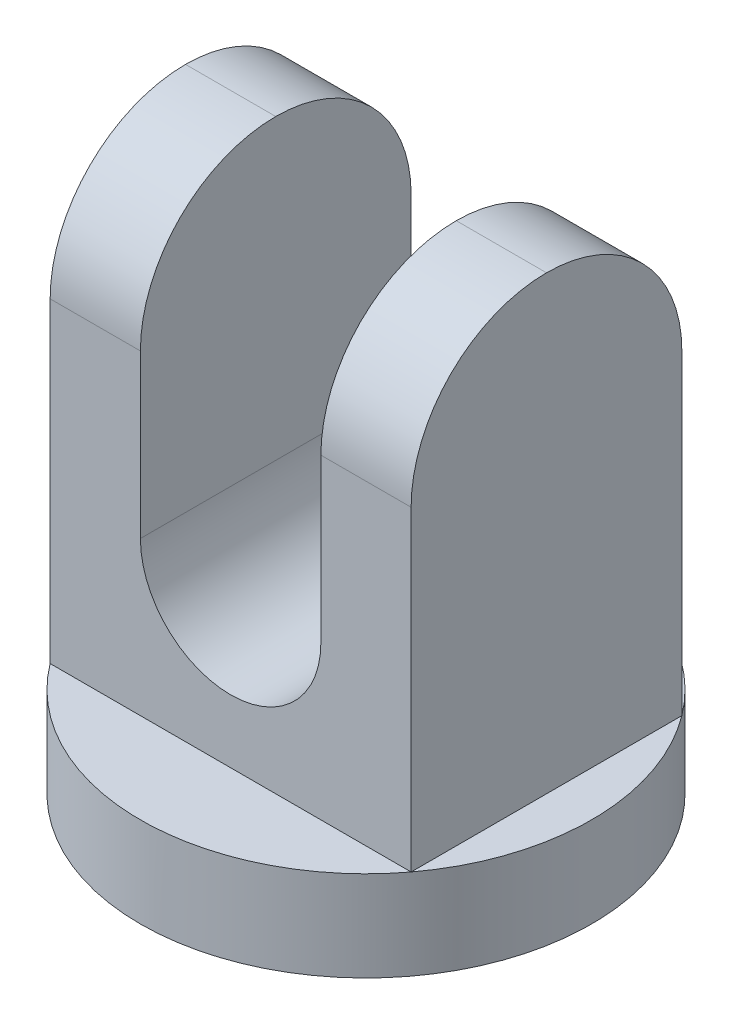
ISO-10303-21;
HEADER;
FILE_DESCRIPTION(('STEP AP214'),'2;1');
FILE_NAME('part.step','',(''),(''),'','','');
FILE_SCHEMA(('AUTOMOTIVE_DESIGN { 1 0 10303 214 1 1 1 1 }'));
ENDSEC;
DATA;
#1=APPLICATION_CONTEXT('core data for automotive mechanical design processes');
#2=APPLICATION_PROTOCOL_DEFINITION('international standard','automotive_design',2000,#1);
#3=PRODUCT_CONTEXT('',#1,'mechanical');
#4=PRODUCT('Part','Part','',(#3));
#5=PRODUCT_RELATED_PRODUCT_CATEGORY('part','',(#4));
#6=PRODUCT_DEFINITION_FORMATION('','',#4);
#7=PRODUCT_DEFINITION_CONTEXT('part definition',#1,'design');
#8=PRODUCT_DEFINITION('design','',#6,#7);
#9=PRODUCT_DEFINITION_SHAPE('','',#8);
#10=(LENGTH_UNIT() NAMED_UNIT(*) SI_UNIT(.MILLI.,.METRE.));
#11=(NAMED_UNIT(*) PLANE_ANGLE_UNIT() SI_UNIT($,.RADIAN.));
#12=(NAMED_UNIT(*) SI_UNIT($,.STERADIAN.) SOLID_ANGLE_UNIT());
#13=UNCERTAINTY_MEASURE_WITH_UNIT(LENGTH_MEASURE(1.E-05),#10,'distance_accuracy_value','');
#14=(GEOMETRIC_REPRESENTATION_CONTEXT(3) GLOBAL_UNCERTAINTY_ASSIGNED_CONTEXT((#13)) GLOBAL_UNIT_ASSIGNED_CONTEXT((#10,
#11,#12)) REPRESENTATION_CONTEXT('',''));
#15=CARTESIAN_POINT('',(0.,0.,0.));
#16=DIRECTION('',(0.,0.,1.));
#17=DIRECTION('',(1.,0.,0.));
#18=AXIS2_PLACEMENT_3D('',#15,#16,#17);
#19=CARTESIAN_POINT('',(0.,450.,0.));
#20=DIRECTION('',(-1.,0.,0.));
#21=DIRECTION('',(0.,0.,1.));
#22=AXIS2_PLACEMENT_3D('',#19,#20,#21);
#23=CYLINDRICAL_SURFACE('',#22,150.);
#24=CARTESIAN_POINT('',(100.,450.,0.));
#25=DIRECTION('',(1.,0.,0.));
#26=DIRECTION('',(0.,1.,0.));
#27=AXIS2_PLACEMENT_3D('',#24,#25,#26);
#28=CIRCLE('',#27,150.);
#29=CARTESIAN_POINT('',(100.,450.,150.));
#30=VERTEX_POINT('',#29);
#31=CARTESIAN_POINT('',(100.,600.,0.));
#32=VERTEX_POINT('',#31);
#33=EDGE_CURVE('E134',#30,#32,#28,.F.);
#34=ORIENTED_EDGE('',*,*,#33,.F.);
#35=DIRECTION('',(1.,0.,0.));
#36=VECTOR('',#35,1.);
#37=CARTESIAN_POINT('',(-200.,450.,150.));
#38=LINE('',#37,#36);
#39=CARTESIAN_POINT('',(200.,450.,150.));
#40=VERTEX_POINT('',#39);
#41=EDGE_CURVE('E177',#40,#30,#38,.F.);
#42=ORIENTED_EDGE('',*,*,#41,.F.);
#43=CARTESIAN_POINT('',(200.,450.,0.));
#44=DIRECTION('',(-1.,0.,0.));
#45=DIRECTION('',(0.,0.,1.));
#46=AXIS2_PLACEMENT_3D('',#43,#44,#45);
#47=CIRCLE('',#46,150.);
#48=CARTESIAN_POINT('',(200.,600.,0.));
#49=VERTEX_POINT('',#48);
#50=EDGE_CURVE('E174',#49,#40,#47,.F.);
#51=ORIENTED_EDGE('',*,*,#50,.F.);
#52=DIRECTION('',(1.,0.,0.));
#53=VECTOR('',#52,1.);
#54=CARTESIAN_POINT('',(200.,600.,0.));
#55=LINE('',#54,#53);
#56=EDGE_CURVE('E166',#32,#49,#55,.T.);
#57=ORIENTED_EDGE('',*,*,#56,.F.);
#58=EDGE_LOOP('',(#34,#42,#51,#57));
#59=FACE_BOUND('',#58,.T.);
#60=ADVANCED_FACE('F35',(#59),#23,.T.);
#61=CARTESIAN_POINT('',(0.,450.,0.));
#62=DIRECTION('',(1.,0.,0.));
#63=DIRECTION('',(0.,0.,-1.));
#64=AXIS2_PLACEMENT_3D('',#61,#62,#63);
#65=CYLINDRICAL_SURFACE('',#64,150.);
#66=CARTESIAN_POINT('',(100.,450.,0.));
#67=DIRECTION('',(1.,0.,0.));
#68=DIRECTION('',(0.,1.,0.));
#69=AXIS2_PLACEMENT_3D('',#66,#67,#68);
#70=CIRCLE('',#69,150.);
#71=CARTESIAN_POINT('',(100.,450.,-150.));
#72=VERTEX_POINT('',#71);
#73=EDGE_CURVE('E11',#32,#72,#70,.F.);
#74=ORIENTED_EDGE('',*,*,#73,.F.);
#75=ORIENTED_EDGE('',*,*,#56,.T.);
#76=CARTESIAN_POINT('',(200.,450.,0.));
#77=DIRECTION('',(-1.,0.,0.));
#78=DIRECTION('',(0.,0.,1.));
#79=AXIS2_PLACEMENT_3D('',#76,#77,#78);
#80=CIRCLE('',#79,150.);
#81=CARTESIAN_POINT('',(200.,450.,-150.));
#82=VERTEX_POINT('',#81);
#83=EDGE_CURVE('E187',#82,#49,#80,.F.);
#84=ORIENTED_EDGE('',*,*,#83,.F.);
#85=DIRECTION('',(-1.,0.,0.));
#86=VECTOR('',#85,1.);
#87=CARTESIAN_POINT('',(200.,450.,-150.));
#88=LINE('',#87,#86);
#89=EDGE_CURVE('E58',#72,#82,#88,.F.);
#90=ORIENTED_EDGE('',*,*,#89,.F.);
#91=EDGE_LOOP('',(#74,#75,#84,#90));
#92=FACE_BOUND('',#91,.T.);
#93=ADVANCED_FACE('F236',(#92),#65,.T.);
#94=CARTESIAN_POINT('',(0.,100.,0.));
#95=DIRECTION('',(0.,1.,0.));
#96=DIRECTION('',(0.,0.,1.));
#97=AXIS2_PLACEMENT_3D('',#94,#95,#96);
#98=PLANE('',#97);
#99=DIRECTION('',(0.,0.,-1.));
#100=VECTOR('',#99,1.);
#101=CARTESIAN_POINT('',(200.,100.,-150.));
#102=LINE('',#101,#100);
#103=CARTESIAN_POINT('',(200.,100.,150.));
#104=VERTEX_POINT('',#103);
#105=CARTESIAN_POINT('',(200.,100.,-150.));
#106=VERTEX_POINT('',#105);
#107=EDGE_CURVE('E142',#104,#106,#102,.T.);
#108=ORIENTED_EDGE('',*,*,#107,.F.);
#109=CARTESIAN_POINT('',(0.,100.,0.));
#110=DIRECTION('',(0.,1.,0.));
#111=DIRECTION('',(0.,0.,1.));
#112=AXIS2_PLACEMENT_3D('',#109,#110,#111);
#113=CIRCLE('',#112,250.);
#114=EDGE_CURVE('E163',#104,#106,#113,.T.);
#115=ORIENTED_EDGE('',*,*,#114,.T.);
#116=EDGE_LOOP('',(#108,#115));
#117=FACE_BOUND('',#116,.T.);
#118=ADVANCED_FACE('F222',(#117),#98,.T.);
#119=DIRECTION('',(1.,0.,0.));
#120=VECTOR('',#119,1.);
#121=CARTESIAN_POINT('',(-200.,100.,150.));
#122=LINE('',#121,#120);
#123=CARTESIAN_POINT('',(-200.,100.,150.));
#124=VERTEX_POINT('',#123);
#125=EDGE_CURVE('E151',#124,#104,#122,.T.);
#126=ORIENTED_EDGE('',*,*,#125,.F.);
#127=EDGE_CURVE('E168',#124,#104,#113,.T.);
#128=ORIENTED_EDGE('',*,*,#127,.T.);
#129=EDGE_LOOP('',(#126,#128));
#130=FACE_BOUND('',#129,.T.);
#131=ADVANCED_FACE('F205',(#130),#98,.T.);
#132=DIRECTION('',(0.,0.,1.));
#133=VECTOR('',#132,1.);
#134=CARTESIAN_POINT('',(-200.,100.,-150.));
#135=LINE('',#134,#133);
#136=CARTESIAN_POINT('',(-200.,100.,-150.));
#137=VERTEX_POINT('',#136);
#138=EDGE_CURVE('E148',#137,#124,#135,.T.);
#139=ORIENTED_EDGE('',*,*,#138,.F.);
#140=EDGE_CURVE('E213',#137,#124,#113,.T.);
#141=ORIENTED_EDGE('',*,*,#140,.T.);
#142=EDGE_LOOP('',(#139,#141));
#143=FACE_BOUND('',#142,.T.);
#144=ADVANCED_FACE('F215',(#143),#98,.T.);
#145=CARTESIAN_POINT('',(0.,100.,0.));
#146=DIRECTION('',(0.,-1.,0.));
#147=DIRECTION('',(0.,0.,-1.));
#148=AXIS2_PLACEMENT_3D('',#145,#146,#147);
#149=CYLINDRICAL_SURFACE('',#148,250.);
#150=ORIENTED_EDGE('',*,*,#114,.F.);
#151=ORIENTED_EDGE('',*,*,#127,.F.);
#152=ORIENTED_EDGE('',*,*,#140,.F.);
#153=EDGE_CURVE('E167',#106,#137,#113,.T.);
#154=ORIENTED_EDGE('',*,*,#153,.F.);
#155=EDGE_LOOP('',(#150,#151,#152,#154));
#156=FACE_BOUND('',#155,.T.);
#157=CARTESIAN_POINT('',(0.,0.,0.));
#158=DIRECTION('',(0.,1.,0.));
#159=DIRECTION('',(0.,0.,1.));
#160=AXIS2_PLACEMENT_3D('',#157,#158,#159);
#161=CIRCLE('',#160,250.);
#162=CARTESIAN_POINT('',(0.,0.,250.));
#163=VERTEX_POINT('',#162);
#164=EDGE_CURVE('E162',#163,#163,#161,.T.);
#165=ORIENTED_EDGE('',*,*,#164,.T.);
#166=EDGE_LOOP('',(#165));
#167=FACE_BOUND('',#166,.T.);
#168=ADVANCED_FACE('F210',(#156,#167),#149,.T.);
#169=DIRECTION('',(-1.,0.,0.));
#170=VECTOR('',#169,1.);
#171=CARTESIAN_POINT('',(-200.,100.,-150.));
#172=LINE('',#171,#170);
#173=EDGE_CURVE('E145',#106,#137,#172,.T.);
#174=ORIENTED_EDGE('',*,*,#173,.F.);
#175=ORIENTED_EDGE('',*,*,#153,.T.);
#176=EDGE_LOOP('',(#174,#175));
#177=FACE_BOUND('',#176,.T.);
#178=ADVANCED_FACE('F219',(#177),#98,.T.);
#179=CARTESIAN_POINT('',(0.,0.,0.));
#180=DIRECTION('',(0.,1.,0.));
#181=DIRECTION('',(0.,0.,1.));
#182=AXIS2_PLACEMENT_3D('',#179,#180,#181);
#183=PLANE('',#182);
#184=ORIENTED_EDGE('',*,*,#164,.F.);
#185=EDGE_LOOP('',(#184));
#186=FACE_BOUND('',#185,.T.);
#187=ADVANCED_FACE('F258',(#186),#183,.F.);
#188=CARTESIAN_POINT('',(200.,600.,-150.));
#189=DIRECTION('',(-1.,0.,0.));
#190=DIRECTION('',(0.,0.,1.));
#191=AXIS2_PLACEMENT_3D('',#188,#189,#190);
#192=PLANE('',#191);
#193=DIRECTION('',(0.,-1.,0.));
#194=VECTOR('',#193,1.);
#195=CARTESIAN_POINT('',(200.,600.,-150.));
#196=LINE('',#195,#194);
#197=EDGE_CURVE('E160',#82,#106,#196,.T.);
#198=ORIENTED_EDGE('',*,*,#197,.F.);
#199=ORIENTED_EDGE('',*,*,#83,.T.);
#200=ORIENTED_EDGE('',*,*,#50,.T.);
#201=DIRECTION('',(0.,-1.,0.));
#202=VECTOR('',#201,1.);
#203=CARTESIAN_POINT('',(200.,600.,150.));
#204=LINE('',#203,#202);
#205=EDGE_CURVE('E154',#40,#104,#204,.T.);
#206=ORIENTED_EDGE('',*,*,#205,.T.);
#207=ORIENTED_EDGE('',*,*,#107,.T.);
#208=EDGE_LOOP('',(#198,#199,#200,#206,#207));
#209=FACE_BOUND('',#208,.T.);
#210=ADVANCED_FACE('F224',(#209),#192,.F.);
#211=CARTESIAN_POINT('',(-200.,600.,-150.));
#212=DIRECTION('',(0.,0.,1.));
#213=DIRECTION('',(1.,0.,0.));
#214=AXIS2_PLACEMENT_3D('',#211,#212,#213);
#215=PLANE('',#214);
#216=DIRECTION('',(0.,-1.,0.));
#217=VECTOR('',#216,1.);
#218=CARTESIAN_POINT('',(-100.,600.,-150.));
#219=LINE('',#218,#217);
#220=CARTESIAN_POINT('',(-100.,450.,-150.));
#221=VERTEX_POINT('',#220);
#222=CARTESIAN_POINT('',(-100.,270.,-150.));
#223=VERTEX_POINT('',#222);
#224=EDGE_CURVE('E50',#221,#223,#219,.T.);
#225=ORIENTED_EDGE('',*,*,#224,.T.);
#226=CARTESIAN_POINT('',(0.,270.,-150.));
#227=DIRECTION('',(0.,0.,1.));
#228=DIRECTION('',(1.,0.,0.));
#229=AXIS2_PLACEMENT_3D('',#226,#227,#228);
#230=CIRCLE('',#229,100.);
#231=CARTESIAN_POINT('',(100.,270.,-150.));
#232=VERTEX_POINT('',#231);
#233=EDGE_CURVE('E117',#223,#232,#230,.T.);
#234=ORIENTED_EDGE('',*,*,#233,.T.);
#235=DIRECTION('',(0.,1.,0.));
#236=VECTOR('',#235,1.);
#237=CARTESIAN_POINT('',(100.,600.,-150.));
#238=LINE('',#237,#236);
#239=EDGE_CURVE('E140',#232,#72,#238,.T.);
#240=ORIENTED_EDGE('',*,*,#239,.T.);
#241=ORIENTED_EDGE('',*,*,#89,.T.);
#242=ORIENTED_EDGE('',*,*,#197,.T.);
#243=ORIENTED_EDGE('',*,*,#173,.T.);
#244=DIRECTION('',(0.,-1.,0.));
#245=VECTOR('',#244,1.);
#246=CARTESIAN_POINT('',(-200.,600.,-150.));
#247=LINE('',#246,#245);
#248=CARTESIAN_POINT('',(-200.,450.,-150.));
#249=VERTEX_POINT('',#248);
#250=EDGE_CURVE('E158',#249,#137,#247,.T.);
#251=ORIENTED_EDGE('',*,*,#250,.F.);
#252=EDGE_CURVE('E184',#249,#221,#88,.F.);
#253=ORIENTED_EDGE('',*,*,#252,.T.);
#254=EDGE_LOOP('',(#225,#234,#240,#241,#242,#243,#251,#253));
#255=FACE_BOUND('',#254,.T.);
#256=ADVANCED_FACE('F265',(#255),#215,.F.);
#257=CARTESIAN_POINT('',(-200.,600.,-150.));
#258=DIRECTION('',(1.,0.,0.));
#259=DIRECTION('',(0.,0.,-1.));
#260=AXIS2_PLACEMENT_3D('',#257,#258,#259);
#261=PLANE('',#260);
#262=CARTESIAN_POINT('',(-200.,450.,0.));
#263=DIRECTION('',(1.,0.,0.));
#264=DIRECTION('',(0.,0.,-1.));
#265=AXIS2_PLACEMENT_3D('',#262,#263,#264);
#266=CIRCLE('',#265,150.);
#267=CARTESIAN_POINT('',(-200.,450.,150.));
#268=VERTEX_POINT('',#267);
#269=CARTESIAN_POINT('',(-200.,600.,0.));
#270=VERTEX_POINT('',#269);
#271=EDGE_CURVE('E179',#268,#270,#266,.F.);
#272=ORIENTED_EDGE('',*,*,#271,.T.);
#273=CARTESIAN_POINT('',(-200.,450.,0.));
#274=DIRECTION('',(1.,0.,0.));
#275=DIRECTION('',(0.,0.,-1.));
#276=AXIS2_PLACEMENT_3D('',#273,#274,#275);
#277=CIRCLE('',#276,150.);
#278=EDGE_CURVE('E182',#270,#249,#277,.F.);
#279=ORIENTED_EDGE('',*,*,#278,.T.);
#280=ORIENTED_EDGE('',*,*,#250,.T.);
#281=ORIENTED_EDGE('',*,*,#138,.T.);
#282=DIRECTION('',(0.,-1.,0.));
#283=VECTOR('',#282,1.);
#284=CARTESIAN_POINT('',(-200.,600.,150.));
#285=LINE('',#284,#283);
#286=EDGE_CURVE('E156',#268,#124,#285,.T.);
#287=ORIENTED_EDGE('',*,*,#286,.F.);
#288=EDGE_LOOP('',(#272,#279,#280,#281,#287));
#289=FACE_BOUND('',#288,.T.);
#290=ADVANCED_FACE('F198',(#289),#261,.F.);
#291=CARTESIAN_POINT('',(-200.,600.,150.));
#292=DIRECTION('',(0.,0.,-1.));
#293=DIRECTION('',(-1.,0.,0.));
#294=AXIS2_PLACEMENT_3D('',#291,#292,#293);
#295=PLANE('',#294);
#296=DIRECTION('',(0.,-1.,0.));
#297=VECTOR('',#296,1.);
#298=CARTESIAN_POINT('',(100.,600.,150.));
#299=LINE('',#298,#297);
#300=CARTESIAN_POINT('',(100.,270.,150.));
#301=VERTEX_POINT('',#300);
#302=EDGE_CURVE('E128',#30,#301,#299,.T.);
#303=ORIENTED_EDGE('',*,*,#302,.T.);
#304=CARTESIAN_POINT('',(0.,270.,150.));
#305=DIRECTION('',(0.,0.,-1.));
#306=DIRECTION('',(-1.,0.,0.));
#307=AXIS2_PLACEMENT_3D('',#304,#305,#306);
#308=CIRCLE('',#307,100.);
#309=CARTESIAN_POINT('',(-100.,270.,150.));
#310=VERTEX_POINT('',#309);
#311=EDGE_CURVE('E114',#301,#310,#308,.T.);
#312=ORIENTED_EDGE('',*,*,#311,.T.);
#313=DIRECTION('',(0.,1.,0.));
#314=VECTOR('',#313,1.);
#315=CARTESIAN_POINT('',(-100.,600.,150.));
#316=LINE('',#315,#314);
#317=CARTESIAN_POINT('',(-100.,450.,150.));
#318=VERTEX_POINT('',#317);
#319=EDGE_CURVE('E125',#310,#318,#316,.T.);
#320=ORIENTED_EDGE('',*,*,#319,.T.);
#321=EDGE_CURVE('E176',#318,#268,#38,.F.);
#322=ORIENTED_EDGE('',*,*,#321,.T.);
#323=ORIENTED_EDGE('',*,*,#286,.T.);
#324=ORIENTED_EDGE('',*,*,#125,.T.);
#325=ORIENTED_EDGE('',*,*,#205,.F.);
#326=ORIENTED_EDGE('',*,*,#41,.T.);
#327=EDGE_LOOP('',(#303,#312,#320,#322,#323,#324,#325,#326));
#328=FACE_BOUND('',#327,.T.);
#329=ADVANCED_FACE('F124',(#328),#295,.F.);
#330=CARTESIAN_POINT('',(-100.,450.,0.));
#331=DIRECTION('',(-1.,0.,0.));
#332=DIRECTION('',(0.,-1.,0.));
#333=AXIS2_PLACEMENT_3D('',#330,#331,#332);
#334=CIRCLE('',#333,150.);
#335=CARTESIAN_POINT('',(-100.,600.,0.));
#336=VERTEX_POINT('',#335);
#337=EDGE_CURVE('E132',#336,#318,#334,.F.);
#338=ORIENTED_EDGE('',*,*,#337,.F.);
#339=EDGE_CURVE('E171',#270,#336,#55,.T.);
#340=ORIENTED_EDGE('',*,*,#339,.F.);
#341=ORIENTED_EDGE('',*,*,#271,.F.);
#342=ORIENTED_EDGE('',*,*,#321,.F.);
#343=EDGE_LOOP('',(#338,#340,#341,#342));
#344=FACE_BOUND('',#343,.T.);
#345=ADVANCED_FACE('F193',(#344),#23,.T.);
#346=CARTESIAN_POINT('',(-100.,450.,0.));
#347=DIRECTION('',(-1.,0.,0.));
#348=DIRECTION('',(0.,-1.,0.));
#349=AXIS2_PLACEMENT_3D('',#346,#347,#348);
#350=CIRCLE('',#349,150.);
#351=EDGE_CURVE('E43',#221,#336,#350,.F.);
#352=ORIENTED_EDGE('',*,*,#351,.F.);
#353=ORIENTED_EDGE('',*,*,#252,.F.);
#354=ORIENTED_EDGE('',*,*,#278,.F.);
#355=ORIENTED_EDGE('',*,*,#339,.T.);
#356=EDGE_LOOP('',(#352,#353,#354,#355));
#357=FACE_BOUND('',#356,.T.);
#358=ADVANCED_FACE('F37',(#357),#65,.T.);
#359=CARTESIAN_POINT('',(100.,600.,-250.));
#360=DIRECTION('',(1.,0.,0.));
#361=DIRECTION('',(0.,1.,0.));
#362=AXIS2_PLACEMENT_3D('',#359,#360,#361);
#363=PLANE('',#362);
#364=DIRECTION('',(0.,0.,1.));
#365=VECTOR('',#364,1.);
#366=CARTESIAN_POINT('',(100.,270.,-250.));
#367=LINE('',#366,#365);
#368=EDGE_CURVE('E119',#232,#301,#367,.T.);
#369=ORIENTED_EDGE('',*,*,#368,.T.);
#370=ORIENTED_EDGE('',*,*,#302,.F.);
#371=ORIENTED_EDGE('',*,*,#33,.T.);
#372=ORIENTED_EDGE('',*,*,#73,.T.);
#373=ORIENTED_EDGE('',*,*,#239,.F.);
#374=EDGE_LOOP('',(#369,#370,#371,#372,#373));
#375=FACE_BOUND('',#374,.T.);
#376=ADVANCED_FACE('F233',(#375),#363,.F.);
#377=CARTESIAN_POINT('',(-100.,600.,-250.));
#378=DIRECTION('',(-1.,0.,0.));
#379=DIRECTION('',(0.,-1.,0.));
#380=AXIS2_PLACEMENT_3D('',#377,#378,#379);
#381=PLANE('',#380);
#382=ORIENTED_EDGE('',*,*,#351,.T.);
#383=ORIENTED_EDGE('',*,*,#337,.T.);
#384=ORIENTED_EDGE('',*,*,#319,.F.);
#385=DIRECTION('',(0.,0.,1.));
#386=VECTOR('',#385,1.);
#387=CARTESIAN_POINT('',(-100.,270.,-250.));
#388=LINE('',#387,#386);
#389=EDGE_CURVE('E111',#223,#310,#388,.T.);
#390=ORIENTED_EDGE('',*,*,#389,.F.);
#391=ORIENTED_EDGE('',*,*,#224,.F.);
#392=EDGE_LOOP('',(#382,#383,#384,#390,#391));
#393=FACE_BOUND('',#392,.T.);
#394=ADVANCED_FACE('F130',(#393),#381,.F.);
#395=CARTESIAN_POINT('',(0.,270.,-250.));
#396=DIRECTION('',(0.,0.,1.));
#397=DIRECTION('',(1.,0.,0.));
#398=AXIS2_PLACEMENT_3D('',#395,#396,#397);
#399=CYLINDRICAL_SURFACE('',#398,100.);
#400=ORIENTED_EDGE('',*,*,#233,.F.);
#401=ORIENTED_EDGE('',*,*,#389,.T.);
#402=ORIENTED_EDGE('',*,*,#311,.F.);
#403=ORIENTED_EDGE('',*,*,#368,.F.);
#404=EDGE_LOOP('',(#400,#401,#402,#403));
#405=FACE_BOUND('',#404,.T.);
#406=ADVANCED_FACE('F113',(#405),#399,.F.);
#407=CLOSED_SHELL('',(#60,#93,#118,#131,#144,#168,#178,#187,#210,#256,#290,#329,#345,#358,#376,
#394,#406));
#408=MANIFOLD_SOLID_BREP('B2',#407);
#409=ADVANCED_BREP_SHAPE_REPRESENTATION('',(#18,#408),#14);
#410=SHAPE_DEFINITION_REPRESENTATION(#9,#409);
ENDSEC;
END-ISO-10303-21;
